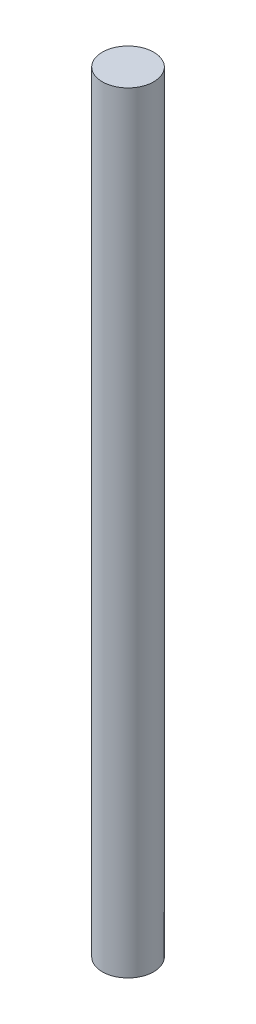
ISO-10303-21;
HEADER;
FILE_DESCRIPTION(('STEP AP214'),'2;1');
FILE_NAME('part.step','',(''),(''),'','','');
FILE_SCHEMA(('AUTOMOTIVE_DESIGN { 1 0 10303 214 1 1 1 1 }'));
ENDSEC;
DATA;
#1=APPLICATION_CONTEXT('core data for automotive mechanical design processes');
#2=APPLICATION_PROTOCOL_DEFINITION('international standard','automotive_design',2000,#1);
#3=PRODUCT_CONTEXT('',#1,'mechanical');
#4=PRODUCT('Part','Part','',(#3));
#5=PRODUCT_RELATED_PRODUCT_CATEGORY('part','',(#4));
#6=PRODUCT_DEFINITION_FORMATION('','',#4);
#7=PRODUCT_DEFINITION_CONTEXT('part definition',#1,'design');
#8=PRODUCT_DEFINITION('design','',#6,#7);
#9=PRODUCT_DEFINITION_SHAPE('','',#8);
#10=(LENGTH_UNIT() NAMED_UNIT(*) SI_UNIT(.MILLI.,.METRE.));
#11=(NAMED_UNIT(*) PLANE_ANGLE_UNIT() SI_UNIT($,.RADIAN.));
#12=(NAMED_UNIT(*) SI_UNIT($,.STERADIAN.) SOLID_ANGLE_UNIT());
#13=UNCERTAINTY_MEASURE_WITH_UNIT(LENGTH_MEASURE(1.E-05),#10,'distance_accuracy_value','');
#14=(GEOMETRIC_REPRESENTATION_CONTEXT(3) GLOBAL_UNCERTAINTY_ASSIGNED_CONTEXT((#13)) GLOBAL_UNIT_ASSIGNED_CONTEXT((#10,
#11,#12)) REPRESENTATION_CONTEXT('',''));
#15=CARTESIAN_POINT('',(0.,0.,0.));
#16=DIRECTION('',(0.,0.,1.));
#17=DIRECTION('',(1.,0.,0.));
#18=AXIS2_PLACEMENT_3D('',#15,#16,#17);
#19=CARTESIAN_POINT('',(0.,90.,0.));
#20=DIRECTION('',(0.,-1.,0.));
#21=DIRECTION('',(0.,0.,-1.));
#22=AXIS2_PLACEMENT_3D('',#19,#20,#21);
#23=CYLINDRICAL_SURFACE('',#22,6.);
#24=CARTESIAN_POINT('',(0.,90.,0.));
#25=DIRECTION('',(0.,1.,0.));
#26=DIRECTION('',(0.,0.,1.));
#27=AXIS2_PLACEMENT_3D('',#24,#25,#26);
#28=CIRCLE('',#27,6.);
#29=CARTESIAN_POINT('',(0.,90.,-6.));
#30=VERTEX_POINT('',#29);
#31=EDGE_CURVE('E10',#30,#30,#28,.T.);
#32=CARTESIAN_POINT('',(0.,-90.,0.));
#33=DIRECTION('',(0.,1.,0.));
#34=DIRECTION('',(0.,0.,1.));
#35=AXIS2_PLACEMENT_3D('',#32,#33,#34);
#36=CIRCLE('',#35,6.);
#37=CARTESIAN_POINT('',(0.,-90.,-6.));
#38=VERTEX_POINT('',#37);
#39=EDGE_CURVE('E34',#38,#38,#36,.T.);
#40=CARTESIAN_POINT('',(0.,90.,-6.));
#41=CARTESIAN_POINT('',(0.,88.125,-6.));
#42=CARTESIAN_POINT('',(0.,86.25,-6.));
#43=CARTESIAN_POINT('',(0.,82.5,-6.));
#44=CARTESIAN_POINT('',(0.,80.625,-6.));
#45=CARTESIAN_POINT('',(0.,76.875,-6.));
#46=CARTESIAN_POINT('',(0.,75.,-6.));
#47=CARTESIAN_POINT('',(0.,71.25,-6.));
#48=CARTESIAN_POINT('',(0.,69.375,-6.));
#49=CARTESIAN_POINT('',(0.,65.625,-6.));
#50=CARTESIAN_POINT('',(0.,63.75,-6.));
#51=CARTESIAN_POINT('',(0.,60.,-6.));
#52=CARTESIAN_POINT('',(0.,58.125,-6.));
#53=CARTESIAN_POINT('',(0.,54.375,-6.));
#54=CARTESIAN_POINT('',(0.,52.5,-6.));
#55=CARTESIAN_POINT('',(0.,48.75,-6.));
#56=CARTESIAN_POINT('',(0.,46.875,-6.));
#57=CARTESIAN_POINT('',(0.,43.125,-6.));
#58=CARTESIAN_POINT('',(0.,41.25,-6.));
#59=CARTESIAN_POINT('',(0.,37.5,-6.));
#60=CARTESIAN_POINT('',(0.,35.625,-6.));
#61=CARTESIAN_POINT('',(0.,31.875,-6.));
#62=CARTESIAN_POINT('',(0.,30.,-6.));
#63=CARTESIAN_POINT('',(0.,26.25,-6.));
#64=CARTESIAN_POINT('',(0.,24.375,-6.));
#65=CARTESIAN_POINT('',(0.,20.625,-6.));
#66=CARTESIAN_POINT('',(0.,18.75,-6.));
#67=CARTESIAN_POINT('',(0.,15.,-6.));
#68=CARTESIAN_POINT('',(0.,13.125,-6.));
#69=CARTESIAN_POINT('',(0.,9.37499999999998,-6.));
#70=CARTESIAN_POINT('',(0.,7.49999999999998,-6.));
#71=CARTESIAN_POINT('',(0.,3.74999999999998,-6.));
#72=CARTESIAN_POINT('',(0.,1.87499999999997,-6.));
#73=CARTESIAN_POINT('',(0.,-1.87500000000003,-6.));
#74=CARTESIAN_POINT('',(0.,-3.75000000000003,-6.));
#75=CARTESIAN_POINT('',(0.,-7.50000000000003,-6.));
#76=CARTESIAN_POINT('',(0.,-9.37500000000004,-6.));
#77=CARTESIAN_POINT('',(0.,-13.125,-6.));
#78=CARTESIAN_POINT('',(0.,-15.,-6.));
#79=CARTESIAN_POINT('',(0.,-18.75,-6.));
#80=CARTESIAN_POINT('',(0.,-20.625,-6.));
#81=CARTESIAN_POINT('',(0.,-24.375,-6.));
#82=CARTESIAN_POINT('',(0.,-26.25,-6.));
#83=CARTESIAN_POINT('',(0.,-30.,-6.));
#84=CARTESIAN_POINT('',(0.,-31.875,-6.));
#85=CARTESIAN_POINT('',(0.,-35.625,-6.));
#86=CARTESIAN_POINT('',(0.,-37.5,-6.));
#87=CARTESIAN_POINT('',(0.,-41.25,-6.));
#88=CARTESIAN_POINT('',(0.,-43.125,-6.));
#89=CARTESIAN_POINT('',(0.,-46.875,-6.));
#90=CARTESIAN_POINT('',(0.,-48.75,-6.));
#91=CARTESIAN_POINT('',(0.,-52.5,-6.));
#92=CARTESIAN_POINT('',(0.,-54.375,-6.));
#93=CARTESIAN_POINT('',(0.,-58.125,-6.));
#94=CARTESIAN_POINT('',(0.,-60.,-6.));
#95=CARTESIAN_POINT('',(0.,-63.75,-6.));
#96=CARTESIAN_POINT('',(0.,-65.625,-6.));
#97=CARTESIAN_POINT('',(0.,-69.375,-6.));
#98=CARTESIAN_POINT('',(0.,-71.25,-6.));
#99=CARTESIAN_POINT('',(0.,-75.,-6.));
#100=CARTESIAN_POINT('',(0.,-76.875,-6.));
#101=CARTESIAN_POINT('',(0.,-80.625,-6.));
#102=CARTESIAN_POINT('',(0.,-82.5,-6.));
#103=CARTESIAN_POINT('',(0.,-86.25,-6.));
#104=CARTESIAN_POINT('',(0.,-88.125,-6.));
#105=CARTESIAN_POINT('',(0.,-90.,-6.));
#106=B_SPLINE_CURVE_WITH_KNOTS('',3,(#40,#41,#42,#43,#44,#45,#46,#47,#48,#49,#50,#51,#52,#53,
#54,#55,#56,#57,#58,#59,#60,#61,#62,#63,#64,#65,#66,#67,#68,#69,#70,#71,#72,#73,#74,#75,#76,#77,
#78,#79,#80,#81,#82,#83,#84,#85,#86,#87,#88,#89,#90,#91,#92,#93,#94,#95,#96,#97,#98,#99,#100,
#101,#102,#103,#104,#105),.UNSPECIFIED.,.F.,.F.,(4,2,2,2,2,2,2,2,2,2,2,2,2,2,2,2,2,2,2,2,2,2,2,
2,2,2,2,2,2,2,2,2,4),(0.,5.62499999999999,11.25,16.875,22.5,28.125,33.75,39.375,45.,50.625,
56.25,61.875,67.5,73.125,78.75,84.375,90.,95.625,101.25,106.875,112.5,118.125,123.75,129.375,
135.,140.625,146.25,151.875,157.5,163.125,168.75,174.375,180.),.UNSPECIFIED.);
#107=EDGE_CURVE('BSEAM31',#30,#38,#106,.T.);
#108=ORIENTED_EDGE('',*,*,#31,.F.);
#109=ORIENTED_EDGE('',*,*,#39,.T.);
#110=ORIENTED_EDGE('',*,*,#107,.T.);
#111=ORIENTED_EDGE('',*,*,#107,.F.);
#112=EDGE_LOOP('',(#108,#110,#109,#111));
#113=FACE_BOUND('',#112,.T.);
#114=ADVANCED_FACE('F31',(#113),#23,.T.);
#115=CARTESIAN_POINT('',(0.,90.,0.));
#116=DIRECTION('',(0.,1.,0.));
#117=DIRECTION('',(0.,0.,1.));
#118=AXIS2_PLACEMENT_3D('',#115,#116,#117);
#119=PLANE('',#118);
#120=ORIENTED_EDGE('',*,*,#31,.T.);
#121=EDGE_LOOP('',(#120));
#122=FACE_BOUND('',#121,.T.);
#123=ADVANCED_FACE('F46',(#122),#119,.T.);
#124=CARTESIAN_POINT('',(0.,-90.,0.));
#125=DIRECTION('',(0.,1.,0.));
#126=DIRECTION('',(0.,0.,1.));
#127=AXIS2_PLACEMENT_3D('',#124,#125,#126);
#128=PLANE('',#127);
#129=ORIENTED_EDGE('',*,*,#39,.F.);
#130=EDGE_LOOP('',(#129));
#131=FACE_BOUND('',#130,.T.);
#132=ADVANCED_FACE('F44',(#131),#128,.F.);
#133=CLOSED_SHELL('',(#114,#123,#132));
#134=MANIFOLD_SOLID_BREP('B2',#133);
#135=ADVANCED_BREP_SHAPE_REPRESENTATION('',(#18,#134),#14);
#136=SHAPE_DEFINITION_REPRESENTATION(#9,#135);
ENDSEC;
END-ISO-10303-21;
